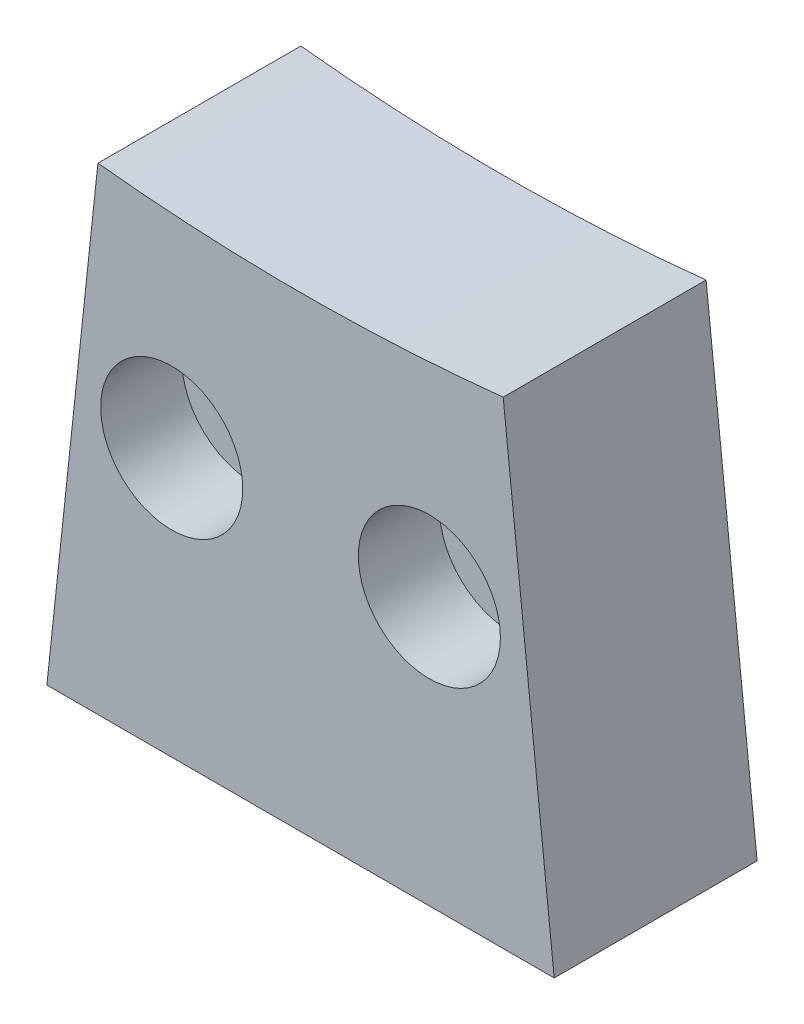
ISO-10303-21;
HEADER;
FILE_DESCRIPTION(('STEP AP214'),'2;1');
FILE_NAME('part.step','',(''),(''),'','','');
FILE_SCHEMA(('AUTOMOTIVE_DESIGN { 1 0 10303 214 1 1 1 1 }'));
ENDSEC;
DATA;
#1=APPLICATION_CONTEXT('core data for automotive mechanical design processes');
#2=APPLICATION_PROTOCOL_DEFINITION('international standard','automotive_design',2000,#1);
#3=PRODUCT_CONTEXT('',#1,'mechanical');
#4=PRODUCT('Part','Part','',(#3));
#5=PRODUCT_RELATED_PRODUCT_CATEGORY('part','',(#4));
#6=PRODUCT_DEFINITION_FORMATION('','',#4);
#7=PRODUCT_DEFINITION_CONTEXT('part definition',#1,'design');
#8=PRODUCT_DEFINITION('design','',#6,#7);
#9=PRODUCT_DEFINITION_SHAPE('','',#8);
#10=(LENGTH_UNIT() NAMED_UNIT(*) SI_UNIT(.MILLI.,.METRE.));
#11=(NAMED_UNIT(*) PLANE_ANGLE_UNIT() SI_UNIT($,.RADIAN.));
#12=(NAMED_UNIT(*) SI_UNIT($,.STERADIAN.) SOLID_ANGLE_UNIT());
#13=UNCERTAINTY_MEASURE_WITH_UNIT(LENGTH_MEASURE(1.E-05),#10,'distance_accuracy_value','');
#14=(GEOMETRIC_REPRESENTATION_CONTEXT(3) GLOBAL_UNCERTAINTY_ASSIGNED_CONTEXT((#13)) GLOBAL_UNIT_ASSIGNED_CONTEXT((#10,
#11,#12)) REPRESENTATION_CONTEXT('',''));
#15=CARTESIAN_POINT('',(0.,0.,0.));
#16=DIRECTION('',(0.,0.,1.));
#17=DIRECTION('',(1.,0.,0.));
#18=AXIS2_PLACEMENT_3D('',#15,#16,#17);
#19=CARTESIAN_POINT('',(6.34904811162474,-103.806019035874,-0.000999999999999265));
#20=DIRECTION('',(0.,0.,1.));
#21=DIRECTION('',(1.,0.,0.));
#22=AXIS2_PLACEMENT_3D('',#19,#20,#21);
#23=CYLINDRICAL_SURFACE('',#22,1.75);
#24=CARTESIAN_POINT('',(6.34904811162474,-103.806019035874,0.));
#25=DIRECTION('',(0.,0.,-1.));
#26=DIRECTION('',(-1.,0.,0.));
#27=AXIS2_PLACEMENT_3D('',#24,#25,#26);
#28=CIRCLE('',#27,1.75);
#29=CARTESIAN_POINT('',(4.59904811162474,-103.806019035874,0.));
#30=VERTEX_POINT('',#29);
#31=EDGE_CURVE('E128',#30,#30,#28,.F.);
#32=ORIENTED_EDGE('',*,*,#31,.F.);
#33=EDGE_LOOP('',(#32));
#34=FACE_BOUND('',#33,.T.);
#35=CARTESIAN_POINT('',(6.34904811162474,-103.806019035874,6.));
#36=DIRECTION('',(0.,0.,1.));
#37=DIRECTION('',(1.,0.,0.));
#38=AXIS2_PLACEMENT_3D('',#35,#36,#37);
#39=CIRCLE('',#38,1.75);
#40=CARTESIAN_POINT('',(8.09904811162474,-103.806019035874,6.));
#41=VERTEX_POINT('',#40);
#42=EDGE_CURVE('E142',#41,#41,#39,.F.);
#43=ORIENTED_EDGE('',*,*,#42,.F.);
#44=EDGE_LOOP('',(#43));
#45=FACE_BOUND('',#44,.T.);
#46=ADVANCED_FACE('F36',(#34,#45),#23,.F.);
#47=CARTESIAN_POINT('',(-6.34904811162474,-103.806019035874,-0.000999999999999265));
#48=DIRECTION('',(0.,0.,1.));
#49=DIRECTION('',(1.,0.,0.));
#50=AXIS2_PLACEMENT_3D('',#47,#48,#49);
#51=CYLINDRICAL_SURFACE('',#50,1.75);
#52=CARTESIAN_POINT('',(-6.34904811162474,-103.806019035874,0.));
#53=DIRECTION('',(0.,0.,-1.));
#54=DIRECTION('',(-1.,0.,0.));
#55=AXIS2_PLACEMENT_3D('',#52,#53,#54);
#56=CIRCLE('',#55,1.75);
#57=CARTESIAN_POINT('',(-8.09904811162474,-103.806019035874,0.));
#58=VERTEX_POINT('',#57);
#59=EDGE_CURVE('E120',#58,#58,#56,.F.);
#60=ORIENTED_EDGE('',*,*,#59,.F.);
#61=EDGE_LOOP('',(#60));
#62=FACE_BOUND('',#61,.T.);
#63=CARTESIAN_POINT('',(-6.34904811162474,-103.806019035874,6.));
#64=DIRECTION('',(0.,0.,1.));
#65=DIRECTION('',(1.,0.,0.));
#66=AXIS2_PLACEMENT_3D('',#63,#64,#65);
#67=CIRCLE('',#66,1.75);
#68=CARTESIAN_POINT('',(-4.59904811162474,-103.806019035874,6.));
#69=VERTEX_POINT('',#68);
#70=EDGE_CURVE('E40',#69,#69,#67,.F.);
#71=ORIENTED_EDGE('',*,*,#70,.F.);
#72=EDGE_LOOP('',(#71));
#73=FACE_BOUND('',#72,.T.);
#74=ADVANCED_FACE('F153',(#62,#73),#51,.F.);
#75=CARTESIAN_POINT('',(0.,0.,10.));
#76=DIRECTION('',(0.,0.,-1.));
#77=DIRECTION('',(-1.,0.,0.));
#78=AXIS2_PLACEMENT_3D('',#75,#76,#77);
#79=CYLINDRICAL_SURFACE('',#78,94.);
#80=CARTESIAN_POINT('',(0.,0.,0.));
#81=DIRECTION('',(0.,0.,-1.));
#82=DIRECTION('',(-1.,0.,0.));
#83=AXIS2_PLACEMENT_3D('',#80,#81,#82);
#84=CIRCLE('',#83,94.);
#85=CARTESIAN_POINT('',(9.98590581497537,-93.4680784281695,0.));
#86=VERTEX_POINT('',#85);
#87=CARTESIAN_POINT('',(-9.98590581497535,-93.4680784281695,0.));
#88=VERTEX_POINT('',#87);
#89=EDGE_CURVE('E102',#86,#88,#84,.T.);
#90=ORIENTED_EDGE('',*,*,#89,.T.);
#91=DIRECTION('',(0.,0.,-1.));
#92=VECTOR('',#91,1.);
#93=CARTESIAN_POINT('',(-9.98590581497535,-93.4680784281695,10.));
#94=LINE('',#93,#92);
#95=CARTESIAN_POINT('',(-9.98590581497535,-93.4680784281695,10.));
#96=VERTEX_POINT('',#95);
#97=EDGE_CURVE('E11',#96,#88,#94,.T.);
#98=ORIENTED_EDGE('',*,*,#97,.F.);
#99=CARTESIAN_POINT('',(0.,0.,10.));
#100=DIRECTION('',(0.,0.,-1.));
#101=DIRECTION('',(-1.,0.,0.));
#102=AXIS2_PLACEMENT_3D('',#99,#100,#101);
#103=CIRCLE('',#102,94.);
#104=CARTESIAN_POINT('',(9.98590581497537,-93.4680784281695,10.));
#105=VERTEX_POINT('',#104);
#106=EDGE_CURVE('E89',#105,#96,#103,.T.);
#107=ORIENTED_EDGE('',*,*,#106,.F.);
#108=DIRECTION('',(0.,0.,-1.));
#109=VECTOR('',#108,1.);
#110=CARTESIAN_POINT('',(9.98590581497537,-93.4680784281695,10.));
#111=LINE('',#110,#109);
#112=EDGE_CURVE('E98',#105,#86,#111,.T.);
#113=ORIENTED_EDGE('',*,*,#112,.T.);
#114=EDGE_LOOP('',(#90,#98,#107,#113));
#115=FACE_BOUND('',#114,.T.);
#116=ADVANCED_FACE('F38',(#115),#79,.F.);
#117=CARTESIAN_POINT('',(-9.98590581497535,-93.4680784281695,10.));
#118=DIRECTION('',(0.994341259874143,-0.106233040584846,0.));
#119=DIRECTION('',(0.106233040584846,0.994341259874143,0.));
#120=AXIS2_PLACEMENT_3D('',#117,#118,#119);
#121=PLANE('',#120);
#122=DIRECTION('',(-0.106233040584846,-0.994341259874143,0.));
#123=VECTOR('',#122,1.);
#124=CARTESIAN_POINT('',(-9.98590581497535,-93.4680784281695,0.));
#125=LINE('',#124,#123);
#126=CARTESIAN_POINT('',(-12.5,-117.,0.));
#127=VERTEX_POINT('',#126);
#128=EDGE_CURVE('E93',#88,#127,#125,.T.);
#129=ORIENTED_EDGE('',*,*,#128,.T.);
#130=DIRECTION('',(0.,0.,-1.));
#131=VECTOR('',#130,1.);
#132=CARTESIAN_POINT('',(-12.5,-117.,10.));
#133=LINE('',#132,#131);
#134=CARTESIAN_POINT('',(-12.5,-117.,10.));
#135=VERTEX_POINT('',#134);
#136=EDGE_CURVE('E46',#135,#127,#133,.T.);
#137=ORIENTED_EDGE('',*,*,#136,.F.);
#138=DIRECTION('',(-0.106233040584846,-0.994341259874143,0.));
#139=VECTOR('',#138,1.);
#140=CARTESIAN_POINT('',(-9.98590581497535,-93.4680784281695,10.));
#141=LINE('',#140,#139);
#142=EDGE_CURVE('E84',#96,#135,#141,.T.);
#143=ORIENTED_EDGE('',*,*,#142,.F.);
#144=ORIENTED_EDGE('',*,*,#97,.T.);
#145=EDGE_LOOP('',(#129,#137,#143,#144));
#146=FACE_BOUND('',#145,.T.);
#147=ADVANCED_FACE('F92',(#146),#121,.F.);
#148=CARTESIAN_POINT('',(-12.5,-117.,10.));
#149=DIRECTION('',(0.,1.,0.));
#150=DIRECTION('',(-1.,0.,0.));
#151=AXIS2_PLACEMENT_3D('',#148,#149,#150);
#152=PLANE('',#151);
#153=CARTESIAN_POINT('',(-4.75000000000006,-117.,6.));
#154=DIRECTION('',(0.,-1.,0.));
#155=DIRECTION('',(1.,0.,0.));
#156=AXIS2_PLACEMENT_3D('',#153,#154,#155);
#157=CIRCLE('',#156,1.025);
#158=CARTESIAN_POINT('',(-3.72500000000006,-117.,6.));
#159=VERTEX_POINT('',#158);
#160=EDGE_CURVE('E123',#159,#159,#157,.T.);
#161=ORIENTED_EDGE('',*,*,#160,.F.);
#162=EDGE_LOOP('',(#161));
#163=FACE_BOUND('',#162,.T.);
#164=CARTESIAN_POINT('',(4.74999999999994,-117.,6.));
#165=DIRECTION('',(0.,-1.,0.));
#166=DIRECTION('',(1.,0.,0.));
#167=AXIS2_PLACEMENT_3D('',#164,#165,#166);
#168=CIRCLE('',#167,1.025);
#169=CARTESIAN_POINT('',(5.77499999999993,-117.,6.));
#170=VERTEX_POINT('',#169);
#171=EDGE_CURVE('E116',#170,#170,#168,.T.);
#172=ORIENTED_EDGE('',*,*,#171,.F.);
#173=EDGE_LOOP('',(#172));
#174=FACE_BOUND('',#173,.T.);
#175=DIRECTION('',(1.,0.,0.));
#176=VECTOR('',#175,1.);
#177=CARTESIAN_POINT('',(-12.5,-117.,0.));
#178=LINE('',#177,#176);
#179=CARTESIAN_POINT('',(12.5,-117.,0.));
#180=VERTEX_POINT('',#179);
#181=EDGE_CURVE('E71',#127,#180,#178,.T.);
#182=ORIENTED_EDGE('',*,*,#181,.T.);
#183=DIRECTION('',(0.,0.,-1.));
#184=VECTOR('',#183,1.);
#185=CARTESIAN_POINT('',(12.5,-117.,10.));
#186=LINE('',#185,#184);
#187=CARTESIAN_POINT('',(12.5,-117.,10.));
#188=VERTEX_POINT('',#187);
#189=EDGE_CURVE('E94',#188,#180,#186,.T.);
#190=ORIENTED_EDGE('',*,*,#189,.F.);
#191=DIRECTION('',(1.,0.,0.));
#192=VECTOR('',#191,1.);
#193=CARTESIAN_POINT('',(-12.5,-117.,10.));
#194=LINE('',#193,#192);
#195=EDGE_CURVE('E87',#135,#188,#194,.T.);
#196=ORIENTED_EDGE('',*,*,#195,.F.);
#197=ORIENTED_EDGE('',*,*,#136,.T.);
#198=EDGE_LOOP('',(#182,#190,#196,#197));
#199=FACE_BOUND('',#198,.T.);
#200=ADVANCED_FACE('F96',(#163,#174,#199),#152,.F.);
#201=CARTESIAN_POINT('',(9.98590581497537,-93.4680784281695,10.));
#202=DIRECTION('',(-0.994341259874144,-0.106233040584843,0.));
#203=DIRECTION('',(0.106233040584843,-0.994341259874144,0.));
#204=AXIS2_PLACEMENT_3D('',#201,#202,#203);
#205=PLANE('',#204);
#206=DIRECTION('',(-0.106233040584843,0.994341259874144,0.));
#207=VECTOR('',#206,1.);
#208=CARTESIAN_POINT('',(9.98590581497537,-93.4680784281695,0.));
#209=LINE('',#208,#207);
#210=EDGE_CURVE('E77',#180,#86,#209,.T.);
#211=ORIENTED_EDGE('',*,*,#210,.T.);
#212=ORIENTED_EDGE('',*,*,#112,.F.);
#213=DIRECTION('',(-0.106233040584843,0.994341259874144,0.));
#214=VECTOR('',#213,1.);
#215=CARTESIAN_POINT('',(9.98590581497537,-93.4680784281695,10.));
#216=LINE('',#215,#214);
#217=EDGE_CURVE('E54',#188,#105,#216,.T.);
#218=ORIENTED_EDGE('',*,*,#217,.F.);
#219=ORIENTED_EDGE('',*,*,#189,.T.);
#220=EDGE_LOOP('',(#211,#212,#218,#219));
#221=FACE_BOUND('',#220,.T.);
#222=ADVANCED_FACE('F110',(#221),#205,.F.);
#223=CARTESIAN_POINT('',(0.,0.,10.));
#224=DIRECTION('',(0.,0.,-1.));
#225=DIRECTION('',(-1.,0.,0.));
#226=AXIS2_PLACEMENT_3D('',#223,#224,#225);
#227=PLANE('',#226);
#228=CARTESIAN_POINT('',(6.34904811162474,-103.806019035874,10.));
#229=DIRECTION('',(0.,0.,1.));
#230=DIRECTION('',(1.,0.,0.));
#231=AXIS2_PLACEMENT_3D('',#228,#229,#230);
#232=CIRCLE('',#231,3.5);
#233=CARTESIAN_POINT('',(9.84904811162474,-103.806019035874,10.));
#234=VERTEX_POINT('',#233);
#235=EDGE_CURVE('E139',#234,#234,#232,.T.);
#236=ORIENTED_EDGE('',*,*,#235,.F.);
#237=EDGE_LOOP('',(#236));
#238=FACE_BOUND('',#237,.T.);
#239=CARTESIAN_POINT('',(-6.34904811162474,-103.806019035874,10.));
#240=DIRECTION('',(0.,0.,1.));
#241=DIRECTION('',(1.,0.,0.));
#242=AXIS2_PLACEMENT_3D('',#239,#240,#241);
#243=CIRCLE('',#242,3.5);
#244=CARTESIAN_POINT('',(-2.84904811162474,-103.806019035874,10.));
#245=VERTEX_POINT('',#244);
#246=EDGE_CURVE('E136',#245,#245,#243,.T.);
#247=ORIENTED_EDGE('',*,*,#246,.F.);
#248=EDGE_LOOP('',(#247));
#249=FACE_BOUND('',#248,.T.);
#250=ORIENTED_EDGE('',*,*,#106,.T.);
#251=ORIENTED_EDGE('',*,*,#142,.T.);
#252=ORIENTED_EDGE('',*,*,#195,.T.);
#253=ORIENTED_EDGE('',*,*,#217,.T.);
#254=EDGE_LOOP('',(#250,#251,#252,#253));
#255=FACE_BOUND('',#254,.T.);
#256=ADVANCED_FACE('F85',(#238,#249,#255),#227,.F.);
#257=CARTESIAN_POINT('',(0.,0.,0.));
#258=DIRECTION('',(0.,0.,-1.));
#259=DIRECTION('',(-1.,0.,0.));
#260=AXIS2_PLACEMENT_3D('',#257,#258,#259);
#261=PLANE('',#260);
#262=ORIENTED_EDGE('',*,*,#59,.T.);
#263=EDGE_LOOP('',(#262));
#264=FACE_BOUND('',#263,.T.);
#265=ORIENTED_EDGE('',*,*,#31,.T.);
#266=EDGE_LOOP('',(#265));
#267=FACE_BOUND('',#266,.T.);
#268=ORIENTED_EDGE('',*,*,#89,.F.);
#269=ORIENTED_EDGE('',*,*,#210,.F.);
#270=ORIENTED_EDGE('',*,*,#181,.F.);
#271=ORIENTED_EDGE('',*,*,#128,.F.);
#272=EDGE_LOOP('',(#268,#269,#270,#271));
#273=FACE_BOUND('',#272,.T.);
#274=ADVANCED_FACE('F113',(#264,#267,#273),#261,.T.);
#275=CARTESIAN_POINT('',(4.74999999999994,-109.,6.));
#276=DIRECTION('',(0.,-1.,0.));
#277=DIRECTION('',(1.,0.,0.));
#278=AXIS2_PLACEMENT_3D('',#275,#276,#277);
#279=CYLINDRICAL_SURFACE('',#278,1.025);
#280=CARTESIAN_POINT('',(4.74999999999994,-109.,6.));
#281=DIRECTION('',(0.,-1.,0.));
#282=DIRECTION('',(1.,0.,0.));
#283=AXIS2_PLACEMENT_3D('',#280,#281,#282);
#284=CIRCLE('',#283,1.025);
#285=CARTESIAN_POINT('',(5.77499999999994,-109.,6.));
#286=VERTEX_POINT('',#285);
#287=EDGE_CURVE('E119',#286,#286,#284,.T.);
#288=ORIENTED_EDGE('',*,*,#287,.F.);
#289=EDGE_LOOP('',(#288));
#290=FACE_BOUND('',#289,.T.);
#291=ORIENTED_EDGE('',*,*,#171,.T.);
#292=EDGE_LOOP('',(#291));
#293=FACE_BOUND('',#292,.T.);
#294=ADVANCED_FACE('F176',(#290,#293),#279,.F.);
#295=CARTESIAN_POINT('',(4.74999999999994,-109.,6.));
#296=DIRECTION('',(0.,-1.,0.));
#297=DIRECTION('',(1.,0.,0.));
#298=AXIS2_PLACEMENT_3D('',#295,#296,#297);
#299=PLANE('',#298);
#300=ORIENTED_EDGE('',*,*,#287,.T.);
#301=EDGE_LOOP('',(#300));
#302=FACE_BOUND('',#301,.T.);
#303=ADVANCED_FACE('F172',(#302),#299,.T.);
#304=CARTESIAN_POINT('',(-4.75000000000006,-109.,6.));
#305=DIRECTION('',(0.,-1.,0.));
#306=DIRECTION('',(1.,0.,0.));
#307=AXIS2_PLACEMENT_3D('',#304,#305,#306);
#308=CYLINDRICAL_SURFACE('',#307,1.025);
#309=CARTESIAN_POINT('',(-4.75000000000006,-109.,6.));
#310=DIRECTION('',(0.,-1.,0.));
#311=DIRECTION('',(1.,0.,0.));
#312=AXIS2_PLACEMENT_3D('',#309,#310,#311);
#313=CIRCLE('',#312,1.025);
#314=CARTESIAN_POINT('',(-3.72500000000006,-109.,6.));
#315=VERTEX_POINT('',#314);
#316=EDGE_CURVE('E105',#315,#315,#313,.T.);
#317=ORIENTED_EDGE('',*,*,#316,.F.);
#318=EDGE_LOOP('',(#317));
#319=FACE_BOUND('',#318,.T.);
#320=ORIENTED_EDGE('',*,*,#160,.T.);
#321=EDGE_LOOP('',(#320));
#322=FACE_BOUND('',#321,.T.);
#323=ADVANCED_FACE('F168',(#319,#322),#308,.F.);
#324=CARTESIAN_POINT('',(-4.75000000000006,-109.,6.));
#325=DIRECTION('',(0.,-1.,0.));
#326=DIRECTION('',(1.,0.,0.));
#327=AXIS2_PLACEMENT_3D('',#324,#325,#326);
#328=PLANE('',#327);
#329=ORIENTED_EDGE('',*,*,#316,.T.);
#330=EDGE_LOOP('',(#329));
#331=FACE_BOUND('',#330,.T.);
#332=ADVANCED_FACE('F164',(#331),#328,.T.);
#333=CARTESIAN_POINT('',(-6.34904811162474,-103.806019035874,6.));
#334=DIRECTION('',(0.,0.,1.));
#335=DIRECTION('',(1.,0.,0.));
#336=AXIS2_PLACEMENT_3D('',#333,#334,#335);
#337=PLANE('',#336);
#338=CARTESIAN_POINT('',(-6.34904811162474,-103.806019035874,6.));
#339=DIRECTION('',(0.,0.,1.));
#340=DIRECTION('',(1.,0.,0.));
#341=AXIS2_PLACEMENT_3D('',#338,#339,#340);
#342=CIRCLE('',#341,3.5);
#343=CARTESIAN_POINT('',(-2.84904811162474,-103.806019035874,6.));
#344=VERTEX_POINT('',#343);
#345=EDGE_CURVE('E133',#344,#344,#342,.T.);
#346=ORIENTED_EDGE('',*,*,#345,.T.);
#347=EDGE_LOOP('',(#346));
#348=FACE_BOUND('',#347,.T.);
#349=ORIENTED_EDGE('',*,*,#70,.T.);
#350=EDGE_LOOP('',(#349));
#351=FACE_BOUND('',#350,.T.);
#352=ADVANCED_FACE('F167',(#348,#351),#337,.T.);
#353=CARTESIAN_POINT('',(-6.34904811162474,-103.806019035874,6.));
#354=DIRECTION('',(0.,0.,1.));
#355=DIRECTION('',(1.,0.,0.));
#356=AXIS2_PLACEMENT_3D('',#353,#354,#355);
#357=CYLINDRICAL_SURFACE('',#356,3.5);
#358=ORIENTED_EDGE('',*,*,#345,.F.);
#359=EDGE_LOOP('',(#358));
#360=FACE_BOUND('',#359,.T.);
#361=ORIENTED_EDGE('',*,*,#246,.T.);
#362=EDGE_LOOP('',(#361));
#363=FACE_BOUND('',#362,.T.);
#364=ADVANCED_FACE('F222',(#360,#363),#357,.F.);
#365=CARTESIAN_POINT('',(6.34904811162474,-103.806019035874,6.));
#366=DIRECTION('',(0.,0.,1.));
#367=DIRECTION('',(1.,0.,0.));
#368=AXIS2_PLACEMENT_3D('',#365,#366,#367);
#369=CYLINDRICAL_SURFACE('',#368,3.5);
#370=CARTESIAN_POINT('',(6.34904811162474,-103.806019035874,6.));
#371=DIRECTION('',(0.,0.,1.));
#372=DIRECTION('',(1.,0.,0.));
#373=AXIS2_PLACEMENT_3D('',#370,#371,#372);
#374=CIRCLE('',#373,3.5);
#375=CARTESIAN_POINT('',(9.84904811162474,-103.806019035874,6.));
#376=VERTEX_POINT('',#375);
#377=EDGE_CURVE('E143',#376,#376,#374,.T.);
#378=ORIENTED_EDGE('',*,*,#377,.F.);
#379=EDGE_LOOP('',(#378));
#380=FACE_BOUND('',#379,.T.);
#381=ORIENTED_EDGE('',*,*,#235,.T.);
#382=EDGE_LOOP('',(#381));
#383=FACE_BOUND('',#382,.T.);
#384=ADVANCED_FACE('F231',(#380,#383),#369,.F.);
#385=CARTESIAN_POINT('',(0.,0.,6.));
#386=DIRECTION('',(0.,0.,1.));
#387=DIRECTION('',(1.,0.,0.));
#388=AXIS2_PLACEMENT_3D('',#385,#386,#387);
#389=PLANE('',#388);
#390=ORIENTED_EDGE('',*,*,#42,.T.);
#391=EDGE_LOOP('',(#390));
#392=FACE_BOUND('',#391,.T.);
#393=ORIENTED_EDGE('',*,*,#377,.T.);
#394=EDGE_LOOP('',(#393));
#395=FACE_BOUND('',#394,.T.);
#396=ADVANCED_FACE('F149',(#392,#395),#389,.T.);
#397=CLOSED_SHELL('',(#46,#74,#116,#147,#200,#222,#256,#274,#294,#303,#323,#332,#352,#364,#384,#396));
#398=MANIFOLD_SOLID_BREP('B2',#397);
#399=ADVANCED_BREP_SHAPE_REPRESENTATION('',(#18,#398),#14);
#400=SHAPE_DEFINITION_REPRESENTATION(#9,#399);
ENDSEC;
END-ISO-10303-21;
